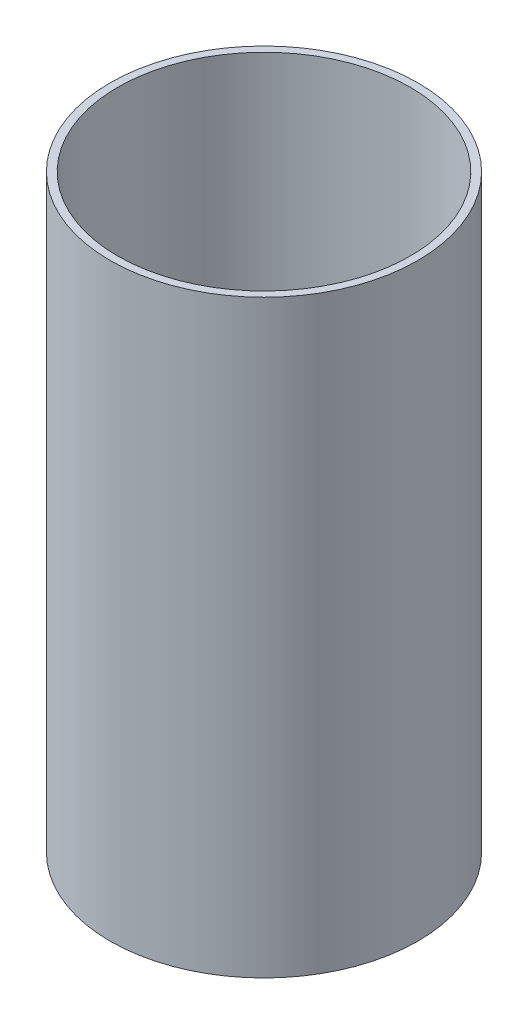
ISO-10303-21;
HEADER;
FILE_DESCRIPTION(('STEP AP214'),'2;1');
FILE_NAME('part.step','',(''),(''),'','','');
FILE_SCHEMA(('AUTOMOTIVE_DESIGN { 1 0 10303 214 1 1 1 1 }'));
ENDSEC;
DATA;
#1=APPLICATION_CONTEXT('core data for automotive mechanical design processes');
#2=APPLICATION_PROTOCOL_DEFINITION('international standard','automotive_design',2000,#1);
#3=PRODUCT_CONTEXT('',#1,'mechanical');
#4=PRODUCT('Part','Part','',(#3));
#5=PRODUCT_RELATED_PRODUCT_CATEGORY('part','',(#4));
#6=PRODUCT_DEFINITION_FORMATION('','',#4);
#7=PRODUCT_DEFINITION_CONTEXT('part definition',#1,'design');
#8=PRODUCT_DEFINITION('design','',#6,#7);
#9=PRODUCT_DEFINITION_SHAPE('','',#8);
#10=(LENGTH_UNIT() NAMED_UNIT(*) SI_UNIT(.MILLI.,.METRE.));
#11=(NAMED_UNIT(*) PLANE_ANGLE_UNIT() SI_UNIT($,.RADIAN.));
#12=(NAMED_UNIT(*) SI_UNIT($,.STERADIAN.) SOLID_ANGLE_UNIT());
#13=UNCERTAINTY_MEASURE_WITH_UNIT(LENGTH_MEASURE(1.E-05),#10,'distance_accuracy_value','');
#14=(GEOMETRIC_REPRESENTATION_CONTEXT(3) GLOBAL_UNCERTAINTY_ASSIGNED_CONTEXT((#13)) GLOBAL_UNIT_ASSIGNED_CONTEXT((#10,
#11,#12)) REPRESENTATION_CONTEXT('',''));
#15=CARTESIAN_POINT('',(0.,0.,0.));
#16=DIRECTION('',(0.,0.,1.));
#17=DIRECTION('',(1.,0.,0.));
#18=AXIS2_PLACEMENT_3D('',#15,#16,#17);
#19=CARTESIAN_POINT('',(292.878943302343,284.938810356011,0.));
#20=DIRECTION('',(0.,1.,0.));
#21=DIRECTION('',(0.,0.,1.));
#22=AXIS2_PLACEMENT_3D('',#19,#20,#21);
#23=PLANE('',#22);
#24=CARTESIAN_POINT('',(349.778943302343,284.938810356011,0.));
#25=DIRECTION('',(0.,1.,0.));
#26=DIRECTION('',(0.,0.,1.));
#27=AXIS2_PLACEMENT_3D('',#24,#25,#26);
#28=CIRCLE('',#27,54.0817397932585);
#29=CARTESIAN_POINT('',(349.778943302343,284.938810356011,54.0817397932585));
#30=VERTEX_POINT('',#29);
#31=EDGE_CURVE('E67',#30,#30,#28,.T.);
#32=ORIENTED_EDGE('',*,*,#31,.F.);
#33=EDGE_LOOP('',(#32));
#34=FACE_BOUND('',#33,.T.);
#35=CARTESIAN_POINT('',(349.778943302343,284.938810356011,0.));
#36=DIRECTION('',(0.,1.,0.));
#37=DIRECTION('',(0.,0.,1.));
#38=AXIS2_PLACEMENT_3D('',#35,#36,#37);
#39=CIRCLE('',#38,56.9);
#40=CARTESIAN_POINT('',(349.778943302343,284.938810356011,56.9));
#41=VERTEX_POINT('',#40);
#42=EDGE_CURVE('E61',#41,#41,#39,.T.);
#43=ORIENTED_EDGE('',*,*,#42,.T.);
#44=EDGE_LOOP('',(#43));
#45=FACE_BOUND('',#44,.T.);
#46=ADVANCED_FACE('F43',(#34,#45),#23,.T.);
#47=CARTESIAN_POINT('',(292.878943302343,66.9377678371134,0.));
#48=DIRECTION('',(0.,-1.,0.));
#49=DIRECTION('',(0.,0.,-1.));
#50=AXIS2_PLACEMENT_3D('',#47,#48,#49);
#51=PLANE('',#50);
#52=CARTESIAN_POINT('',(349.778943302343,66.9377678371134,0.));
#53=DIRECTION('',(0.,1.,0.));
#54=DIRECTION('',(0.,0.,1.));
#55=AXIS2_PLACEMENT_3D('',#52,#53,#54);
#56=CIRCLE('',#55,56.9);
#57=CARTESIAN_POINT('',(349.778943302343,66.9377678371134,56.9));
#58=VERTEX_POINT('',#57);
#59=EDGE_CURVE('E56',#58,#58,#56,.T.);
#60=ORIENTED_EDGE('',*,*,#59,.F.);
#61=EDGE_LOOP('',(#60));
#62=FACE_BOUND('',#61,.T.);
#63=ADVANCED_FACE('F76',(#62),#51,.T.);
#64=CARTESIAN_POINT('',(349.778943302343,284.938810356011,0.));
#65=DIRECTION('',(0.,1.,0.));
#66=DIRECTION('',(0.,0.,1.));
#67=AXIS2_PLACEMENT_3D('',#64,#65,#66);
#68=CYLINDRICAL_SURFACE('',#67,56.9);
#69=ORIENTED_EDGE('',*,*,#59,.T.);
#70=EDGE_LOOP('',(#69));
#71=FACE_BOUND('',#70,.T.);
#72=ORIENTED_EDGE('',*,*,#42,.F.);
#73=EDGE_LOOP('',(#72));
#74=FACE_BOUND('',#73,.T.);
#75=ADVANCED_FACE('F79',(#71,#74),#68,.T.);
#76=CARTESIAN_POINT('',(349.778943302343,74.9388103560111,0.));
#77=DIRECTION('',(0.,1.,0.));
#78=DIRECTION('',(0.,0.,1.));
#79=AXIS2_PLACEMENT_3D('',#76,#77,#78);
#80=CYLINDRICAL_SURFACE('',#79,54.0817397932585);
#81=CARTESIAN_POINT('',(349.778943302343,84.9388103560111,0.));
#82=DIRECTION('',(0.,1.,0.));
#83=DIRECTION('',(0.,0.,1.));
#84=AXIS2_PLACEMENT_3D('',#81,#82,#83);
#85=CIRCLE('',#84,54.0817397932585);
#86=CARTESIAN_POINT('',(349.778943302343,84.9388103560111,54.0817397932585));
#87=VERTEX_POINT('',#86);
#88=EDGE_CURVE('E10',#87,#87,#85,.F.);
#89=ORIENTED_EDGE('',*,*,#88,.T.);
#90=EDGE_LOOP('',(#89));
#91=FACE_BOUND('',#90,.T.);
#92=ORIENTED_EDGE('',*,*,#31,.T.);
#93=EDGE_LOOP('',(#92));
#94=FACE_BOUND('',#93,.T.);
#95=ADVANCED_FACE('F72',(#91,#94),#80,.F.);
#96=CARTESIAN_POINT('',(349.778943302343,74.9388103560111,0.));
#97=DIRECTION('',(0.,1.,0.));
#98=DIRECTION('',(0.,0.,1.));
#99=AXIS2_PLACEMENT_3D('',#96,#97,#98);
#100=PLANE('',#99);
#101=CARTESIAN_POINT('',(349.778943302343,74.9388103560111,0.));
#102=DIRECTION('',(0.,1.,0.));
#103=DIRECTION('',(0.,0.,1.));
#104=AXIS2_PLACEMENT_3D('',#101,#102,#103);
#105=CIRCLE('',#104,44.0817397932585);
#106=CARTESIAN_POINT('',(349.778943302343,74.9388103560111,44.0817397932585));
#107=VERTEX_POINT('',#106);
#108=EDGE_CURVE('E51',#107,#107,#105,.T.);
#109=ORIENTED_EDGE('',*,*,#108,.T.);
#110=EDGE_LOOP('',(#109));
#111=FACE_BOUND('',#110,.T.);
#112=ADVANCED_FACE('F87',(#111),#100,.T.);
#113=CARTESIAN_POINT('',(349.778943302343,84.9388103560111,0.));
#114=DIRECTION('',(0.,1.,0.));
#115=DIRECTION('',(0.,0.,1.));
#116=AXIS2_PLACEMENT_3D('',#113,#114,#115);
#117=TOROIDAL_SURFACE('',#116,44.0817397932585,10.);
#118=ORIENTED_EDGE('',*,*,#88,.F.);
#119=EDGE_LOOP('',(#118));
#120=FACE_BOUND('',#119,.T.);
#121=ORIENTED_EDGE('',*,*,#108,.F.);
#122=EDGE_LOOP('',(#121));
#123=FACE_BOUND('',#122,.T.);
#124=ADVANCED_FACE('F45',(#120,#123),#117,.F.);
#125=CLOSED_SHELL('',(#46,#63,#75,#95,#112,#124));
#126=MANIFOLD_SOLID_BREP('B2',#125);
#127=ADVANCED_BREP_SHAPE_REPRESENTATION('',(#18,#126),#14);
#128=SHAPE_DEFINITION_REPRESENTATION(#9,#127);
ENDSEC;
END-ISO-10303-21;
